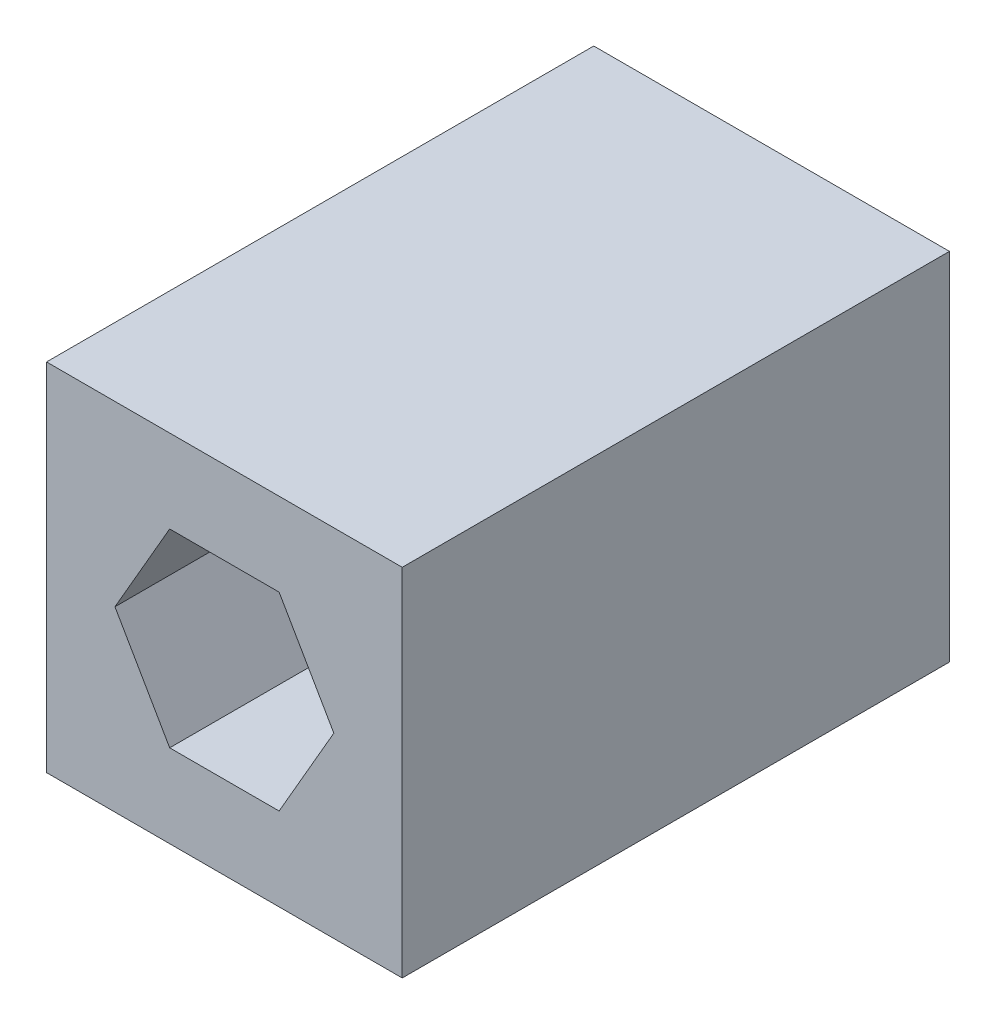
ISO-10303-21;
HEADER;
FILE_DESCRIPTION(('STEP AP214'),'2;1');
FILE_NAME('part.step','',(''),(''),'','','');
FILE_SCHEMA(('AUTOMOTIVE_DESIGN { 1 0 10303 214 1 1 1 1 }'));
ENDSEC;
DATA;
#1=APPLICATION_CONTEXT('core data for automotive mechanical design processes');
#2=APPLICATION_PROTOCOL_DEFINITION('international standard','automotive_design',2000,#1);
#3=PRODUCT_CONTEXT('',#1,'mechanical');
#4=PRODUCT('Part','Part','',(#3));
#5=PRODUCT_RELATED_PRODUCT_CATEGORY('part','',(#4));
#6=PRODUCT_DEFINITION_FORMATION('','',#4);
#7=PRODUCT_DEFINITION_CONTEXT('part definition',#1,'design');
#8=PRODUCT_DEFINITION('design','',#6,#7);
#9=PRODUCT_DEFINITION_SHAPE('','',#8);
#10=(LENGTH_UNIT() NAMED_UNIT(*) SI_UNIT(.MILLI.,.METRE.));
#11=(NAMED_UNIT(*) PLANE_ANGLE_UNIT() SI_UNIT($,.RADIAN.));
#12=(NAMED_UNIT(*) SI_UNIT($,.STERADIAN.) SOLID_ANGLE_UNIT());
#13=UNCERTAINTY_MEASURE_WITH_UNIT(LENGTH_MEASURE(1.E-05),#10,'distance_accuracy_value','');
#14=(GEOMETRIC_REPRESENTATION_CONTEXT(3) GLOBAL_UNCERTAINTY_ASSIGNED_CONTEXT((#13)) GLOBAL_UNIT_ASSIGNED_CONTEXT((#10,
#11,#12)) REPRESENTATION_CONTEXT('',''));
#15=CARTESIAN_POINT('',(0.,0.,0.));
#16=DIRECTION('',(0.,0.,1.));
#17=DIRECTION('',(1.,0.,0.));
#18=AXIS2_PLACEMENT_3D('',#15,#16,#17);
#19=CARTESIAN_POINT('',(0.,0.,200.));
#20=DIRECTION('',(0.,0.,1.));
#21=DIRECTION('',(1.,0.,0.));
#22=AXIS2_PLACEMENT_3D('',#19,#20,#21);
#23=PLANE('',#22);
#24=DIRECTION('',(0.,-1.,0.));
#25=VECTOR('',#24,1.);
#26=CARTESIAN_POINT('',(-65.,65.,200.));
#27=LINE('',#26,#25);
#28=CARTESIAN_POINT('',(-65.,65.,200.));
#29=VERTEX_POINT('',#28);
#30=CARTESIAN_POINT('',(-65.,-65.,200.));
#31=VERTEX_POINT('',#30);
#32=EDGE_CURVE('E160',#29,#31,#27,.T.);
#33=ORIENTED_EDGE('',*,*,#32,.T.);
#34=DIRECTION('',(1.,0.,0.));
#35=VECTOR('',#34,1.);
#36=CARTESIAN_POINT('',(-65.,-65.,200.));
#37=LINE('',#36,#35);
#38=CARTESIAN_POINT('',(65.,-65.,200.));
#39=VERTEX_POINT('',#38);
#40=EDGE_CURVE('E163',#31,#39,#37,.T.);
#41=ORIENTED_EDGE('',*,*,#40,.T.);
#42=DIRECTION('',(0.,1.,0.));
#43=VECTOR('',#42,1.);
#44=CARTESIAN_POINT('',(65.,65.,200.));
#45=LINE('',#44,#43);
#46=CARTESIAN_POINT('',(65.,65.,200.));
#47=VERTEX_POINT('',#46);
#48=EDGE_CURVE('E166',#39,#47,#45,.T.);
#49=ORIENTED_EDGE('',*,*,#48,.T.);
#50=DIRECTION('',(-1.,0.,0.));
#51=VECTOR('',#50,1.);
#52=CARTESIAN_POINT('',(-65.,65.,200.));
#53=LINE('',#52,#51);
#54=EDGE_CURVE('E168',#47,#29,#53,.T.);
#55=ORIENTED_EDGE('',*,*,#54,.T.);
#56=EDGE_LOOP('',(#33,#41,#49,#55));
#57=FACE_BOUND('',#56,.T.);
#58=DIRECTION('',(-1.,0.,0.));
#59=VECTOR('',#58,1.);
#60=CARTESIAN_POINT('',(20.,34.6410161513775,200.));
#61=LINE('',#60,#59);
#62=CARTESIAN_POINT('',(20.,34.6410161513775,200.));
#63=VERTEX_POINT('',#62);
#64=CARTESIAN_POINT('',(-20.,34.6410161513775,200.));
#65=VERTEX_POINT('',#64);
#66=EDGE_CURVE('E117',#63,#65,#61,.T.);
#67=ORIENTED_EDGE('',*,*,#66,.F.);
#68=DIRECTION('',(-0.5,0.866025403784439,0.));
#69=VECTOR('',#68,1.);
#70=CARTESIAN_POINT('',(40.,0.,200.));
#71=LINE('',#70,#69);
#72=CARTESIAN_POINT('',(40.,0.,200.));
#73=VERTEX_POINT('',#72);
#74=EDGE_CURVE('E109',#73,#63,#71,.T.);
#75=ORIENTED_EDGE('',*,*,#74,.F.);
#76=DIRECTION('',(0.5,0.866025403784439,0.));
#77=VECTOR('',#76,1.);
#78=CARTESIAN_POINT('',(20.,-34.6410161513776,200.));
#79=LINE('',#78,#77);
#80=CARTESIAN_POINT('',(20.,-34.6410161513776,200.));
#81=VERTEX_POINT('',#80);
#82=EDGE_CURVE('E138',#81,#73,#79,.T.);
#83=ORIENTED_EDGE('',*,*,#82,.F.);
#84=DIRECTION('',(1.,0.,0.));
#85=VECTOR('',#84,1.);
#86=CARTESIAN_POINT('',(-20.,-34.6410161513775,200.));
#87=LINE('',#86,#85);
#88=CARTESIAN_POINT('',(-20.,-34.6410161513775,200.));
#89=VERTEX_POINT('',#88);
#90=EDGE_CURVE('E136',#89,#81,#87,.T.);
#91=ORIENTED_EDGE('',*,*,#90,.F.);
#92=DIRECTION('',(0.5,-0.866025403784439,0.));
#93=VECTOR('',#92,1.);
#94=CARTESIAN_POINT('',(-40.,0.,200.));
#95=LINE('',#94,#93);
#96=CARTESIAN_POINT('',(-40.,0.,200.));
#97=VERTEX_POINT('',#96);
#98=EDGE_CURVE('E132',#97,#89,#95,.T.);
#99=ORIENTED_EDGE('',*,*,#98,.F.);
#100=DIRECTION('',(-0.5,-0.866025403784439,0.));
#101=VECTOR('',#100,1.);
#102=CARTESIAN_POINT('',(-20.,34.6410161513775,200.));
#103=LINE('',#102,#101);
#104=EDGE_CURVE('E130',#65,#97,#103,.T.);
#105=ORIENTED_EDGE('',*,*,#104,.F.);
#106=EDGE_LOOP('',(#67,#75,#83,#91,#99,#105));
#107=FACE_BOUND('',#106,.T.);
#108=ADVANCED_FACE('F32',(#57,#107),#23,.T.);
#109=CARTESIAN_POINT('',(0.,0.,0.));
#110=DIRECTION('',(0.,0.,1.));
#111=DIRECTION('',(1.,0.,0.));
#112=AXIS2_PLACEMENT_3D('',#109,#110,#111);
#113=PLANE('',#112);
#114=DIRECTION('',(0.,-1.,0.));
#115=VECTOR('',#114,1.);
#116=CARTESIAN_POINT('',(-65.,65.,0.));
#117=LINE('',#116,#115);
#118=CARTESIAN_POINT('',(-65.,65.,0.));
#119=VERTEX_POINT('',#118);
#120=CARTESIAN_POINT('',(-65.,-65.,0.));
#121=VERTEX_POINT('',#120);
#122=EDGE_CURVE('E125',#119,#121,#117,.T.);
#123=ORIENTED_EDGE('',*,*,#122,.F.);
#124=DIRECTION('',(-1.,0.,0.));
#125=VECTOR('',#124,1.);
#126=CARTESIAN_POINT('',(-65.,65.,0.));
#127=LINE('',#126,#125);
#128=CARTESIAN_POINT('',(65.,65.,0.));
#129=VERTEX_POINT('',#128);
#130=EDGE_CURVE('E164',#129,#119,#127,.T.);
#131=ORIENTED_EDGE('',*,*,#130,.F.);
#132=DIRECTION('',(0.,1.,0.));
#133=VECTOR('',#132,1.);
#134=CARTESIAN_POINT('',(65.,65.,0.));
#135=LINE('',#134,#133);
#136=CARTESIAN_POINT('',(65.,-65.,0.));
#137=VERTEX_POINT('',#136);
#138=EDGE_CURVE('E175',#137,#129,#135,.T.);
#139=ORIENTED_EDGE('',*,*,#138,.F.);
#140=DIRECTION('',(1.,0.,0.));
#141=VECTOR('',#140,1.);
#142=CARTESIAN_POINT('',(-65.,-65.,0.));
#143=LINE('',#142,#141);
#144=EDGE_CURVE('E173',#121,#137,#143,.T.);
#145=ORIENTED_EDGE('',*,*,#144,.F.);
#146=EDGE_LOOP('',(#123,#131,#139,#145));
#147=FACE_BOUND('',#146,.T.);
#148=DIRECTION('',(-0.5,0.866025403784439,0.));
#149=VECTOR('',#148,1.);
#150=CARTESIAN_POINT('',(40.,0.,0.));
#151=LINE('',#150,#149);
#152=CARTESIAN_POINT('',(40.,0.,0.));
#153=VERTEX_POINT('',#152);
#154=CARTESIAN_POINT('',(20.,34.6410161513775,0.));
#155=VERTEX_POINT('',#154);
#156=EDGE_CURVE('E55',#153,#155,#151,.T.);
#157=ORIENTED_EDGE('',*,*,#156,.T.);
#158=DIRECTION('',(-1.,0.,0.));
#159=VECTOR('',#158,1.);
#160=CARTESIAN_POINT('',(20.,34.6410161513775,0.));
#161=LINE('',#160,#159);
#162=CARTESIAN_POINT('',(-20.,34.6410161513775,0.));
#163=VERTEX_POINT('',#162);
#164=EDGE_CURVE('E124',#155,#163,#161,.T.);
#165=ORIENTED_EDGE('',*,*,#164,.T.);
#166=DIRECTION('',(-0.5,-0.866025403784439,0.));
#167=VECTOR('',#166,1.);
#168=CARTESIAN_POINT('',(-20.,34.6410161513775,0.));
#169=LINE('',#168,#167);
#170=CARTESIAN_POINT('',(-40.,0.,0.));
#171=VERTEX_POINT('',#170);
#172=EDGE_CURVE('E142',#163,#171,#169,.T.);
#173=ORIENTED_EDGE('',*,*,#172,.T.);
#174=DIRECTION('',(0.5,-0.866025403784439,0.));
#175=VECTOR('',#174,1.);
#176=CARTESIAN_POINT('',(-40.,0.,0.));
#177=LINE('',#176,#175);
#178=CARTESIAN_POINT('',(-20.,-34.6410161513775,0.));
#179=VERTEX_POINT('',#178);
#180=EDGE_CURVE('E145',#171,#179,#177,.T.);
#181=ORIENTED_EDGE('',*,*,#180,.T.);
#182=DIRECTION('',(1.,0.,0.));
#183=VECTOR('',#182,1.);
#184=CARTESIAN_POINT('',(-20.,-34.6410161513775,0.));
#185=LINE('',#184,#183);
#186=CARTESIAN_POINT('',(20.,-34.6410161513776,0.));
#187=VERTEX_POINT('',#186);
#188=EDGE_CURVE('E148',#179,#187,#185,.T.);
#189=ORIENTED_EDGE('',*,*,#188,.T.);
#190=DIRECTION('',(0.5,0.866025403784439,0.));
#191=VECTOR('',#190,1.);
#192=CARTESIAN_POINT('',(20.,-34.6410161513776,0.));
#193=LINE('',#192,#191);
#194=EDGE_CURVE('E118',#187,#153,#193,.T.);
#195=ORIENTED_EDGE('',*,*,#194,.T.);
#196=EDGE_LOOP('',(#157,#165,#173,#181,#189,#195));
#197=FACE_BOUND('',#196,.T.);
#198=ADVANCED_FACE('F193',(#147,#197),#113,.F.);
#199=CARTESIAN_POINT('',(-65.,65.,200.));
#200=DIRECTION('',(1.,0.,0.));
#201=DIRECTION('',(0.,0.,-1.));
#202=AXIS2_PLACEMENT_3D('',#199,#200,#201);
#203=PLANE('',#202);
#204=ORIENTED_EDGE('',*,*,#122,.T.);
#205=DIRECTION('',(0.,0.,-1.));
#206=VECTOR('',#205,1.);
#207=CARTESIAN_POINT('',(-65.,-65.,200.));
#208=LINE('',#207,#206);
#209=EDGE_CURVE('E11',#31,#121,#208,.T.);
#210=ORIENTED_EDGE('',*,*,#209,.F.);
#211=ORIENTED_EDGE('',*,*,#32,.F.);
#212=DIRECTION('',(0.,0.,-1.));
#213=VECTOR('',#212,1.);
#214=CARTESIAN_POINT('',(-65.,65.,200.));
#215=LINE('',#214,#213);
#216=EDGE_CURVE('E170',#29,#119,#215,.T.);
#217=ORIENTED_EDGE('',*,*,#216,.T.);
#218=EDGE_LOOP('',(#204,#210,#211,#217));
#219=FACE_BOUND('',#218,.T.);
#220=ADVANCED_FACE('F34',(#219),#203,.F.);
#221=CARTESIAN_POINT('',(-65.,-65.,200.));
#222=DIRECTION('',(0.,1.,0.));
#223=DIRECTION('',(0.,0.,1.));
#224=AXIS2_PLACEMENT_3D('',#221,#222,#223);
#225=PLANE('',#224);
#226=ORIENTED_EDGE('',*,*,#144,.T.);
#227=DIRECTION('',(0.,0.,-1.));
#228=VECTOR('',#227,1.);
#229=CARTESIAN_POINT('',(65.,-65.,200.));
#230=LINE('',#229,#228);
#231=EDGE_CURVE('E40',#39,#137,#230,.T.);
#232=ORIENTED_EDGE('',*,*,#231,.F.);
#233=ORIENTED_EDGE('',*,*,#40,.F.);
#234=ORIENTED_EDGE('',*,*,#209,.T.);
#235=EDGE_LOOP('',(#226,#232,#233,#234));
#236=FACE_BOUND('',#235,.T.);
#237=ADVANCED_FACE('F203',(#236),#225,.F.);
#238=CARTESIAN_POINT('',(65.,65.,200.));
#239=DIRECTION('',(-1.,0.,0.));
#240=DIRECTION('',(0.,0.,1.));
#241=AXIS2_PLACEMENT_3D('',#238,#239,#240);
#242=PLANE('',#241);
#243=ORIENTED_EDGE('',*,*,#138,.T.);
#244=DIRECTION('',(0.,0.,-1.));
#245=VECTOR('',#244,1.);
#246=CARTESIAN_POINT('',(65.,65.,200.));
#247=LINE('',#246,#245);
#248=EDGE_CURVE('E180',#47,#129,#247,.T.);
#249=ORIENTED_EDGE('',*,*,#248,.F.);
#250=ORIENTED_EDGE('',*,*,#48,.F.);
#251=ORIENTED_EDGE('',*,*,#231,.T.);
#252=EDGE_LOOP('',(#243,#249,#250,#251));
#253=FACE_BOUND('',#252,.T.);
#254=ADVANCED_FACE('F187',(#253),#242,.F.);
#255=CARTESIAN_POINT('',(-65.,65.,200.));
#256=DIRECTION('',(0.,-1.,0.));
#257=DIRECTION('',(0.,0.,-1.));
#258=AXIS2_PLACEMENT_3D('',#255,#256,#257);
#259=PLANE('',#258);
#260=ORIENTED_EDGE('',*,*,#130,.T.);
#261=ORIENTED_EDGE('',*,*,#216,.F.);
#262=ORIENTED_EDGE('',*,*,#54,.F.);
#263=ORIENTED_EDGE('',*,*,#248,.T.);
#264=EDGE_LOOP('',(#260,#261,#262,#263));
#265=FACE_BOUND('',#264,.T.);
#266=ADVANCED_FACE('F197',(#265),#259,.F.);
#267=CARTESIAN_POINT('',(40.,0.,200.));
#268=DIRECTION('',(-0.866025403784439,-0.5,0.));
#269=DIRECTION('',(0.5,-0.866025403784439,0.));
#270=AXIS2_PLACEMENT_3D('',#267,#268,#269);
#271=PLANE('',#270);
#272=ORIENTED_EDGE('',*,*,#156,.F.);
#273=DIRECTION('',(0.,0.,-1.));
#274=VECTOR('',#273,1.);
#275=CARTESIAN_POINT('',(40.,0.,200.));
#276=LINE('',#275,#274);
#277=EDGE_CURVE('E113',#73,#153,#276,.T.);
#278=ORIENTED_EDGE('',*,*,#277,.F.);
#279=ORIENTED_EDGE('',*,*,#74,.T.);
#280=DIRECTION('',(0.,0.,-1.));
#281=VECTOR('',#280,1.);
#282=CARTESIAN_POINT('',(20.,34.6410161513775,200.));
#283=LINE('',#282,#281);
#284=EDGE_CURVE('E112',#63,#155,#283,.T.);
#285=ORIENTED_EDGE('',*,*,#284,.T.);
#286=EDGE_LOOP('',(#272,#278,#279,#285));
#287=FACE_BOUND('',#286,.T.);
#288=ADVANCED_FACE('F111',(#287),#271,.T.);
#289=CARTESIAN_POINT('',(20.,34.6410161513775,200.));
#290=DIRECTION('',(0.,-1.,0.));
#291=DIRECTION('',(1.,0.,0.));
#292=AXIS2_PLACEMENT_3D('',#289,#290,#291);
#293=PLANE('',#292);
#294=ORIENTED_EDGE('',*,*,#164,.F.);
#295=ORIENTED_EDGE('',*,*,#284,.F.);
#296=ORIENTED_EDGE('',*,*,#66,.T.);
#297=DIRECTION('',(0.,0.,-1.));
#298=VECTOR('',#297,1.);
#299=CARTESIAN_POINT('',(-20.,34.6410161513775,200.));
#300=LINE('',#299,#298);
#301=EDGE_CURVE('E126',#65,#163,#300,.T.);
#302=ORIENTED_EDGE('',*,*,#301,.T.);
#303=EDGE_LOOP('',(#294,#295,#296,#302));
#304=FACE_BOUND('',#303,.T.);
#305=ADVANCED_FACE('F121',(#304),#293,.T.);
#306=CARTESIAN_POINT('',(-20.,34.6410161513775,200.));
#307=DIRECTION('',(0.866025403784439,-0.5,0.));
#308=DIRECTION('',(0.5,0.866025403784439,0.));
#309=AXIS2_PLACEMENT_3D('',#306,#307,#308);
#310=PLANE('',#309);
#311=ORIENTED_EDGE('',*,*,#172,.F.);
#312=ORIENTED_EDGE('',*,*,#301,.F.);
#313=ORIENTED_EDGE('',*,*,#104,.T.);
#314=DIRECTION('',(0.,0.,-1.));
#315=VECTOR('',#314,1.);
#316=CARTESIAN_POINT('',(-40.,0.,200.));
#317=LINE('',#316,#315);
#318=EDGE_CURVE('E157',#97,#171,#317,.T.);
#319=ORIENTED_EDGE('',*,*,#318,.T.);
#320=EDGE_LOOP('',(#311,#312,#313,#319));
#321=FACE_BOUND('',#320,.T.);
#322=ADVANCED_FACE('F226',(#321),#310,.T.);
#323=CARTESIAN_POINT('',(-40.,0.,200.));
#324=DIRECTION('',(0.866025403784439,0.5,0.));
#325=DIRECTION('',(-0.5,0.866025403784439,0.));
#326=AXIS2_PLACEMENT_3D('',#323,#324,#325);
#327=PLANE('',#326);
#328=ORIENTED_EDGE('',*,*,#180,.F.);
#329=ORIENTED_EDGE('',*,*,#318,.F.);
#330=ORIENTED_EDGE('',*,*,#98,.T.);
#331=DIRECTION('',(0.,0.,-1.));
#332=VECTOR('',#331,1.);
#333=CARTESIAN_POINT('',(-20.,-34.6410161513775,200.));
#334=LINE('',#333,#332);
#335=EDGE_CURVE('E155',#89,#179,#334,.T.);
#336=ORIENTED_EDGE('',*,*,#335,.T.);
#337=EDGE_LOOP('',(#328,#329,#330,#336));
#338=FACE_BOUND('',#337,.T.);
#339=ADVANCED_FACE('F230',(#338),#327,.T.);
#340=CARTESIAN_POINT('',(-20.,-34.6410161513775,200.));
#341=DIRECTION('',(0.,1.,0.));
#342=DIRECTION('',(-1.,0.,0.));
#343=AXIS2_PLACEMENT_3D('',#340,#341,#342);
#344=PLANE('',#343);
#345=ORIENTED_EDGE('',*,*,#188,.F.);
#346=ORIENTED_EDGE('',*,*,#335,.F.);
#347=ORIENTED_EDGE('',*,*,#90,.T.);
#348=DIRECTION('',(0.,0.,-1.));
#349=VECTOR('',#348,1.);
#350=CARTESIAN_POINT('',(20.,-34.6410161513776,200.));
#351=LINE('',#350,#349);
#352=EDGE_CURVE('E47',#81,#187,#351,.T.);
#353=ORIENTED_EDGE('',*,*,#352,.T.);
#354=EDGE_LOOP('',(#345,#346,#347,#353));
#355=FACE_BOUND('',#354,.T.);
#356=ADVANCED_FACE('F236',(#355),#344,.T.);
#357=CARTESIAN_POINT('',(20.,-34.6410161513776,200.));
#358=DIRECTION('',(-0.866025403784439,0.5,0.));
#359=DIRECTION('',(-0.5,-0.866025403784439,0.));
#360=AXIS2_PLACEMENT_3D('',#357,#358,#359);
#361=PLANE('',#360);
#362=ORIENTED_EDGE('',*,*,#194,.F.);
#363=ORIENTED_EDGE('',*,*,#352,.F.);
#364=ORIENTED_EDGE('',*,*,#82,.T.);
#365=ORIENTED_EDGE('',*,*,#277,.T.);
#366=EDGE_LOOP('',(#362,#363,#364,#365));
#367=FACE_BOUND('',#366,.T.);
#368=ADVANCED_FACE('F240',(#367),#361,.T.);
#369=CLOSED_SHELL('',(#108,#198,#220,#237,#254,#266,#288,#305,#322,#339,#356,#368));
#370=MANIFOLD_SOLID_BREP('B2',#369);
#371=ADVANCED_BREP_SHAPE_REPRESENTATION('',(#18,#370),#14);
#372=SHAPE_DEFINITION_REPRESENTATION(#9,#371);
ENDSEC;
END-ISO-10303-21;
